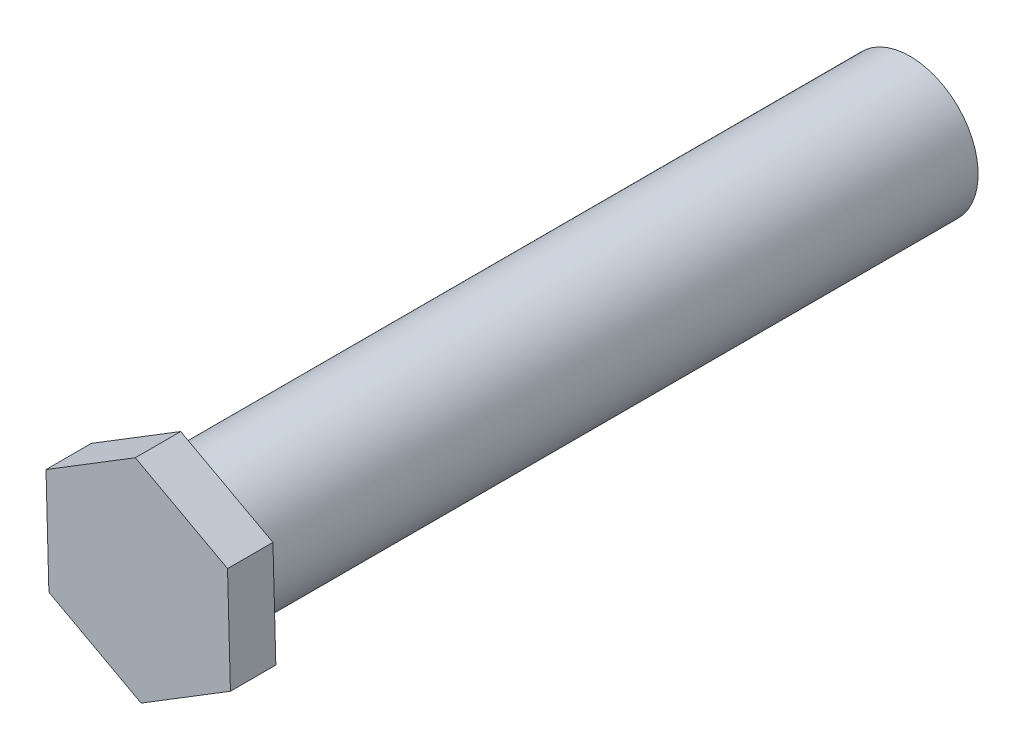
ISO-10303-21;
HEADER;
FILE_DESCRIPTION(('STEP AP214'),'2;1');
FILE_NAME('part.step','',(''),(''),'','','');
FILE_SCHEMA(('AUTOMOTIVE_DESIGN { 1 0 10303 214 1 1 1 1 }'));
ENDSEC;
DATA;
#1=APPLICATION_CONTEXT('core data for automotive mechanical design processes');
#2=APPLICATION_PROTOCOL_DEFINITION('international standard','automotive_design',2000,#1);
#3=PRODUCT_CONTEXT('',#1,'mechanical');
#4=PRODUCT('Part','Part','',(#3));
#5=PRODUCT_RELATED_PRODUCT_CATEGORY('part','',(#4));
#6=PRODUCT_DEFINITION_FORMATION('','',#4);
#7=PRODUCT_DEFINITION_CONTEXT('part definition',#1,'design');
#8=PRODUCT_DEFINITION('design','',#6,#7);
#9=PRODUCT_DEFINITION_SHAPE('','',#8);
#10=(LENGTH_UNIT() NAMED_UNIT(*) SI_UNIT(.MILLI.,.METRE.));
#11=(NAMED_UNIT(*) PLANE_ANGLE_UNIT() SI_UNIT($,.RADIAN.));
#12=(NAMED_UNIT(*) SI_UNIT($,.STERADIAN.) SOLID_ANGLE_UNIT());
#13=UNCERTAINTY_MEASURE_WITH_UNIT(LENGTH_MEASURE(1.E-05),#10,'distance_accuracy_value','');
#14=(GEOMETRIC_REPRESENTATION_CONTEXT(3) GLOBAL_UNCERTAINTY_ASSIGNED_CONTEXT((#13)) GLOBAL_UNIT_ASSIGNED_CONTEXT((#10,
#11,#12)) REPRESENTATION_CONTEXT('',''));
#15=CARTESIAN_POINT('',(0.,0.,0.));
#16=DIRECTION('',(0.,0.,1.));
#17=DIRECTION('',(1.,0.,0.));
#18=AXIS2_PLACEMENT_3D('',#15,#16,#17);
#19=CARTESIAN_POINT('',(4.06220520762606,-2.19814061981236,2.));
#20=DIRECTION('',(-0.999619178660883,-0.0275952469338828,0.));
#21=DIRECTION('',(0.0275952469338828,-0.999619178660883,0.));
#22=AXIS2_PLACEMENT_3D('',#19,#20,#21);
#23=PLANE('',#22);
#24=DIRECTION('',(-0.0275952469338828,0.999619178660883,0.));
#25=VECTOR('',#24,1.);
#26=CARTESIAN_POINT('',(4.06220520762606,-2.19814061981236,0.));
#27=LINE('',#26,#25);
#28=CARTESIAN_POINT('',(4.06220520762606,-2.19814061981236,0.));
#29=VERTEX_POINT('',#28);
#30=CARTESIAN_POINT('',(3.93474822166101,2.41890259528343,0.));
#31=VERTEX_POINT('',#30);
#32=EDGE_CURVE('E119',#29,#31,#27,.T.);
#33=ORIENTED_EDGE('',*,*,#32,.T.);
#34=DIRECTION('',(0.,0.,-1.));
#35=VECTOR('',#34,1.);
#36=CARTESIAN_POINT('',(3.93474822166101,2.41890259528343,2.));
#37=LINE('',#36,#35);
#38=CARTESIAN_POINT('',(3.93474822166101,2.41890259528343,2.));
#39=VERTEX_POINT('',#38);
#40=EDGE_CURVE('E36',#39,#31,#37,.T.);
#41=ORIENTED_EDGE('',*,*,#40,.F.);
#42=DIRECTION('',(-0.0275952469338828,0.999619178660883,0.));
#43=VECTOR('',#42,1.);
#44=CARTESIAN_POINT('',(4.06220520762606,-2.19814061981236,2.));
#45=LINE('',#44,#43);
#46=CARTESIAN_POINT('',(4.06220520762606,-2.19814061981236,2.));
#47=VERTEX_POINT('',#46);
#48=EDGE_CURVE('E130',#47,#39,#45,.T.);
#49=ORIENTED_EDGE('',*,*,#48,.F.);
#50=DIRECTION('',(0.,0.,-1.));
#51=VECTOR('',#50,1.);
#52=CARTESIAN_POINT('',(4.06220520762606,-2.19814061981236,2.));
#53=LINE('',#52,#51);
#54=EDGE_CURVE('E115',#47,#29,#53,.T.);
#55=ORIENTED_EDGE('',*,*,#54,.T.);
#56=EDGE_LOOP('',(#33,#41,#49,#55));
#57=FACE_BOUND('',#56,.T.);
#58=ADVANCED_FACE('F33',(#57),#23,.F.);
#59=CARTESIAN_POINT('',(3.93474822166101,2.41890259528343,2.));
#60=DIRECTION('',(-0.475911404461993,-0.879493226297402,0.));
#61=DIRECTION('',(0.879493226297402,-0.475911404461993,0.));
#62=AXIS2_PLACEMENT_3D('',#59,#60,#61);
#63=PLANE('',#62);
#64=DIRECTION('',(-0.879493226297402,0.475911404461993,0.));
#65=VECTOR('',#64,1.);
#66=CARTESIAN_POINT('',(3.93474822166101,2.41890259528343,0.));
#67=LINE('',#66,#65);
#68=CARTESIAN_POINT('',(-0.127456985965058,4.61704321509579,0.));
#69=VERTEX_POINT('',#68);
#70=EDGE_CURVE('E122',#31,#69,#67,.T.);
#71=ORIENTED_EDGE('',*,*,#70,.T.);
#72=DIRECTION('',(0.,0.,-1.));
#73=VECTOR('',#72,1.);
#74=CARTESIAN_POINT('',(-0.127456985965058,4.61704321509579,2.));
#75=LINE('',#74,#73);
#76=CARTESIAN_POINT('',(-0.127456985965058,4.61704321509579,2.));
#77=VERTEX_POINT('',#76);
#78=EDGE_CURVE('E133',#77,#69,#75,.T.);
#79=ORIENTED_EDGE('',*,*,#78,.F.);
#80=DIRECTION('',(-0.879493226297402,0.475911404461993,0.));
#81=VECTOR('',#80,1.);
#82=CARTESIAN_POINT('',(3.93474822166101,2.41890259528343,2.));
#83=LINE('',#82,#81);
#84=EDGE_CURVE('E88',#39,#77,#83,.T.);
#85=ORIENTED_EDGE('',*,*,#84,.F.);
#86=ORIENTED_EDGE('',*,*,#40,.T.);
#87=EDGE_LOOP('',(#71,#79,#85,#86));
#88=FACE_BOUND('',#87,.T.);
#89=ADVANCED_FACE('F138',(#88),#63,.F.);
#90=CARTESIAN_POINT('',(-0.127456985965058,4.61704321509579,2.));
#91=DIRECTION('',(0.52370777419889,-0.851897979363518,0.));
#92=DIRECTION('',(0.851897979363517,0.52370777419889,0.));
#93=AXIS2_PLACEMENT_3D('',#90,#91,#92);
#94=PLANE('',#93);
#95=DIRECTION('',(-0.851897979363518,-0.52370777419889,0.));
#96=VECTOR('',#95,1.);
#97=CARTESIAN_POINT('',(-0.127456985965058,4.61704321509579,0.));
#98=LINE('',#97,#96);
#99=CARTESIAN_POINT('',(-4.06220520762606,2.19814061981236,0.));
#100=VERTEX_POINT('',#99);
#101=EDGE_CURVE('E125',#69,#100,#98,.T.);
#102=ORIENTED_EDGE('',*,*,#101,.T.);
#103=DIRECTION('',(0.,0.,-1.));
#104=VECTOR('',#103,1.);
#105=CARTESIAN_POINT('',(-4.06220520762606,2.19814061981236,2.));
#106=LINE('',#105,#104);
#107=CARTESIAN_POINT('',(-4.06220520762606,2.19814061981236,2.));
#108=VERTEX_POINT('',#107);
#109=EDGE_CURVE('E110',#108,#100,#106,.T.);
#110=ORIENTED_EDGE('',*,*,#109,.F.);
#111=DIRECTION('',(-0.851897979363518,-0.52370777419889,0.));
#112=VECTOR('',#111,1.);
#113=CARTESIAN_POINT('',(-0.127456985965058,4.61704321509579,2.));
#114=LINE('',#113,#112);
#115=EDGE_CURVE('E101',#77,#108,#114,.T.);
#116=ORIENTED_EDGE('',*,*,#115,.F.);
#117=ORIENTED_EDGE('',*,*,#78,.T.);
#118=EDGE_LOOP('',(#102,#110,#116,#117));
#119=FACE_BOUND('',#118,.T.);
#120=ADVANCED_FACE('F144',(#119),#94,.F.);
#121=CARTESIAN_POINT('',(-4.06220520762606,2.19814061981236,2.));
#122=DIRECTION('',(0.999619178660883,0.0275952469338838,0.));
#123=DIRECTION('',(-0.0275952469338838,0.999619178660883,0.));
#124=AXIS2_PLACEMENT_3D('',#121,#122,#123);
#125=PLANE('',#124);
#126=DIRECTION('',(0.0275952469338838,-0.999619178660883,0.));
#127=VECTOR('',#126,1.);
#128=CARTESIAN_POINT('',(-4.06220520762606,2.19814061981236,0.));
#129=LINE('',#128,#127);
#130=CARTESIAN_POINT('',(-3.934748221661,-2.41890259528343,0.));
#131=VERTEX_POINT('',#130);
#132=EDGE_CURVE('E109',#100,#131,#129,.T.);
#133=ORIENTED_EDGE('',*,*,#132,.T.);
#134=DIRECTION('',(0.,0.,-1.));
#135=VECTOR('',#134,1.);
#136=CARTESIAN_POINT('',(-3.934748221661,-2.41890259528343,2.));
#137=LINE('',#136,#135);
#138=CARTESIAN_POINT('',(-3.934748221661,-2.41890259528343,2.));
#139=VERTEX_POINT('',#138);
#140=EDGE_CURVE('E106',#139,#131,#137,.T.);
#141=ORIENTED_EDGE('',*,*,#140,.F.);
#142=DIRECTION('',(0.0275952469338838,-0.999619178660883,0.));
#143=VECTOR('',#142,1.);
#144=CARTESIAN_POINT('',(-4.06220520762606,2.19814061981236,2.));
#145=LINE('',#144,#143);
#146=EDGE_CURVE('E95',#108,#139,#145,.T.);
#147=ORIENTED_EDGE('',*,*,#146,.F.);
#148=ORIENTED_EDGE('',*,*,#109,.T.);
#149=EDGE_LOOP('',(#133,#141,#147,#148));
#150=FACE_BOUND('',#149,.T.);
#151=ADVANCED_FACE('F107',(#150),#125,.F.);
#152=CARTESIAN_POINT('',(-3.934748221661,-2.41890259528343,2.));
#153=DIRECTION('',(0.475911404461993,0.879493226297402,0.));
#154=DIRECTION('',(-0.879493226297402,0.475911404461993,0.));
#155=AXIS2_PLACEMENT_3D('',#152,#153,#154);
#156=PLANE('',#155);
#157=DIRECTION('',(0.879493226297402,-0.475911404461993,0.));
#158=VECTOR('',#157,1.);
#159=CARTESIAN_POINT('',(-3.934748221661,-2.41890259528343,0.));
#160=LINE('',#159,#158);
#161=CARTESIAN_POINT('',(0.127456985965056,-4.61704321509579,0.));
#162=VERTEX_POINT('',#161);
#163=EDGE_CURVE('E73',#131,#162,#160,.T.);
#164=ORIENTED_EDGE('',*,*,#163,.T.);
#165=DIRECTION('',(0.,0.,-1.));
#166=VECTOR('',#165,1.);
#167=CARTESIAN_POINT('',(0.127456985965056,-4.61704321509579,2.));
#168=LINE('',#167,#166);
#169=CARTESIAN_POINT('',(0.127456985965056,-4.61704321509579,2.));
#170=VERTEX_POINT('',#169);
#171=EDGE_CURVE('E111',#170,#162,#168,.T.);
#172=ORIENTED_EDGE('',*,*,#171,.F.);
#173=DIRECTION('',(0.879493226297402,-0.475911404461993,0.));
#174=VECTOR('',#173,1.);
#175=CARTESIAN_POINT('',(-3.934748221661,-2.41890259528343,2.));
#176=LINE('',#175,#174);
#177=EDGE_CURVE('E99',#139,#170,#176,.T.);
#178=ORIENTED_EDGE('',*,*,#177,.F.);
#179=ORIENTED_EDGE('',*,*,#140,.T.);
#180=EDGE_LOOP('',(#164,#172,#178,#179));
#181=FACE_BOUND('',#180,.T.);
#182=ADVANCED_FACE('F113',(#181),#156,.F.);
#183=CARTESIAN_POINT('',(0.127456985965056,-4.61704321509579,2.));
#184=DIRECTION('',(-0.52370777419889,0.851897979363518,0.));
#185=DIRECTION('',(-0.851897979363518,-0.52370777419889,0.));
#186=AXIS2_PLACEMENT_3D('',#183,#184,#185);
#187=PLANE('',#186);
#188=DIRECTION('',(0.851897979363518,0.52370777419889,0.));
#189=VECTOR('',#188,1.);
#190=CARTESIAN_POINT('',(0.127456985965056,-4.61704321509579,0.));
#191=LINE('',#190,#189);
#192=EDGE_CURVE('E79',#162,#29,#191,.T.);
#193=ORIENTED_EDGE('',*,*,#192,.T.);
#194=ORIENTED_EDGE('',*,*,#54,.F.);
#195=DIRECTION('',(0.851897979363518,0.52370777419889,0.));
#196=VECTOR('',#195,1.);
#197=CARTESIAN_POINT('',(0.127456985965056,-4.61704321509579,2.));
#198=LINE('',#197,#196);
#199=EDGE_CURVE('E50',#170,#47,#198,.T.);
#200=ORIENTED_EDGE('',*,*,#199,.F.);
#201=ORIENTED_EDGE('',*,*,#171,.T.);
#202=EDGE_LOOP('',(#193,#194,#200,#201));
#203=FACE_BOUND('',#202,.T.);
#204=ADVANCED_FACE('F164',(#203),#187,.F.);
#205=CARTESIAN_POINT('',(0.,0.,2.));
#206=DIRECTION('',(0.,0.,1.));
#207=DIRECTION('',(1.,0.,0.));
#208=AXIS2_PLACEMENT_3D('',#205,#206,#207);
#209=PLANE('',#208);
#210=ORIENTED_EDGE('',*,*,#48,.T.);
#211=ORIENTED_EDGE('',*,*,#84,.T.);
#212=ORIENTED_EDGE('',*,*,#115,.T.);
#213=ORIENTED_EDGE('',*,*,#146,.T.);
#214=ORIENTED_EDGE('',*,*,#177,.T.);
#215=ORIENTED_EDGE('',*,*,#199,.T.);
#216=EDGE_LOOP('',(#210,#211,#212,#213,#214,#215));
#217=FACE_BOUND('',#216,.T.);
#218=ADVANCED_FACE('F97',(#217),#209,.T.);
#219=CARTESIAN_POINT('',(0.,0.,0.));
#220=DIRECTION('',(0.,0.,1.));
#221=DIRECTION('',(1.,0.,0.));
#222=AXIS2_PLACEMENT_3D('',#219,#220,#221);
#223=PLANE('',#222);
#224=CARTESIAN_POINT('',(0.,0.,0.));
#225=DIRECTION('',(0.,0.,-1.));
#226=DIRECTION('',(-1.,0.,0.));
#227=AXIS2_PLACEMENT_3D('',#224,#225,#226);
#228=CIRCLE('',#227,3.);
#229=CARTESIAN_POINT('',(-3.,0.,0.));
#230=VERTEX_POINT('',#229);
#231=EDGE_CURVE('E11',#230,#230,#228,.T.);
#232=ORIENTED_EDGE('',*,*,#231,.F.);
#233=EDGE_LOOP('',(#232));
#234=FACE_BOUND('',#233,.T.);
#235=ORIENTED_EDGE('',*,*,#32,.F.);
#236=ORIENTED_EDGE('',*,*,#192,.F.);
#237=ORIENTED_EDGE('',*,*,#163,.F.);
#238=ORIENTED_EDGE('',*,*,#132,.F.);
#239=ORIENTED_EDGE('',*,*,#101,.F.);
#240=ORIENTED_EDGE('',*,*,#70,.F.);
#241=EDGE_LOOP('',(#235,#236,#237,#238,#239,#240));
#242=FACE_BOUND('',#241,.T.);
#243=ADVANCED_FACE('F143',(#234,#242),#223,.F.);
#244=CARTESIAN_POINT('',(0.,0.,-32.));
#245=DIRECTION('',(0.,0.,1.));
#246=DIRECTION('',(1.,0.,0.));
#247=AXIS2_PLACEMENT_3D('',#244,#245,#246);
#248=CYLINDRICAL_SURFACE('',#247,3.);
#249=CARTESIAN_POINT('',(0.,0.,-32.));
#250=DIRECTION('',(0.,0.,-1.));
#251=DIRECTION('',(-1.,0.,0.));
#252=AXIS2_PLACEMENT_3D('',#249,#250,#251);
#253=CIRCLE('',#252,3.);
#254=CARTESIAN_POINT('',(-3.,0.,-32.));
#255=VERTEX_POINT('',#254);
#256=EDGE_CURVE('E123',#255,#255,#253,.T.);
#257=ORIENTED_EDGE('',*,*,#256,.F.);
#258=EDGE_LOOP('',(#257));
#259=FACE_BOUND('',#258,.T.);
#260=ORIENTED_EDGE('',*,*,#231,.T.);
#261=EDGE_LOOP('',(#260));
#262=FACE_BOUND('',#261,.T.);
#263=ADVANCED_FACE('F153',(#259,#262),#248,.T.);
#264=CARTESIAN_POINT('',(0.,0.,-32.));
#265=DIRECTION('',(0.,0.,-1.));
#266=DIRECTION('',(-1.,0.,0.));
#267=AXIS2_PLACEMENT_3D('',#264,#265,#266);
#268=PLANE('',#267);
#269=ORIENTED_EDGE('',*,*,#256,.T.);
#270=EDGE_LOOP('',(#269));
#271=FACE_BOUND('',#270,.T.);
#272=ADVANCED_FACE('F151',(#271),#268,.T.);
#273=CLOSED_SHELL('',(#58,#89,#120,#151,#182,#204,#218,#243,#263,#272));
#274=MANIFOLD_SOLID_BREP('B2',#273);
#275=ADVANCED_BREP_SHAPE_REPRESENTATION('',(#18,#274),#14);
#276=SHAPE_DEFINITION_REPRESENTATION(#9,#275);
ENDSEC;
END-ISO-10303-21;
